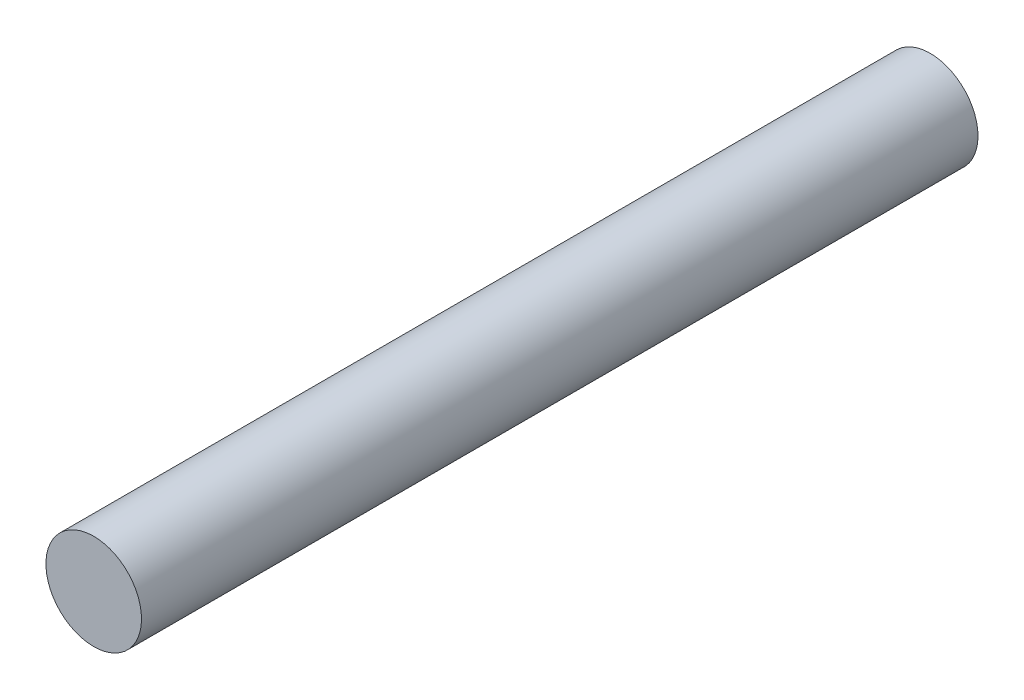
ISO-10303-21;
HEADER;
FILE_DESCRIPTION(('STEP AP214'),'2;1');
FILE_NAME('part.step','',(''),(''),'','','');
FILE_SCHEMA(('AUTOMOTIVE_DESIGN { 1 0 10303 214 1 1 1 1 }'));
ENDSEC;
DATA;
#1=APPLICATION_CONTEXT('core data for automotive mechanical design processes');
#2=APPLICATION_PROTOCOL_DEFINITION('international standard','automotive_design',2000,#1);
#3=PRODUCT_CONTEXT('',#1,'mechanical');
#4=PRODUCT('Part','Part','',(#3));
#5=PRODUCT_RELATED_PRODUCT_CATEGORY('part','',(#4));
#6=PRODUCT_DEFINITION_FORMATION('','',#4);
#7=PRODUCT_DEFINITION_CONTEXT('part definition',#1,'design');
#8=PRODUCT_DEFINITION('design','',#6,#7);
#9=PRODUCT_DEFINITION_SHAPE('','',#8);
#10=(LENGTH_UNIT() NAMED_UNIT(*) SI_UNIT(.MILLI.,.METRE.));
#11=(NAMED_UNIT(*) PLANE_ANGLE_UNIT() SI_UNIT($,.RADIAN.));
#12=(NAMED_UNIT(*) SI_UNIT($,.STERADIAN.) SOLID_ANGLE_UNIT());
#13=UNCERTAINTY_MEASURE_WITH_UNIT(LENGTH_MEASURE(1.E-05),#10,'distance_accuracy_value','');
#14=(GEOMETRIC_REPRESENTATION_CONTEXT(3) GLOBAL_UNCERTAINTY_ASSIGNED_CONTEXT((#13)) GLOBAL_UNIT_ASSIGNED_CONTEXT((#10,
#11,#12)) REPRESENTATION_CONTEXT('',''));
#15=CARTESIAN_POINT('',(0.,0.,0.));
#16=DIRECTION('',(0.,0.,1.));
#17=DIRECTION('',(1.,0.,0.));
#18=AXIS2_PLACEMENT_3D('',#15,#16,#17);
#19=CARTESIAN_POINT('',(67.2550134984817,46.7975623829489,70.));
#20=DIRECTION('',(0.,0.,-1.));
#21=DIRECTION('',(-1.,0.,0.));
#22=AXIS2_PLACEMENT_3D('',#19,#20,#21);
#23=CYLINDRICAL_SURFACE('',#22,4.00000000000001);
#24=CARTESIAN_POINT('',(67.2550134984817,46.7975623829489,70.));
#25=DIRECTION('',(0.,0.,1.));
#26=DIRECTION('',(1.,0.,0.));
#27=AXIS2_PLACEMENT_3D('',#24,#25,#26);
#28=CIRCLE('',#27,4.00000000000001);
#29=CARTESIAN_POINT('',(71.2550134984817,46.7975623829489,70.));
#30=VERTEX_POINT('',#29);
#31=EDGE_CURVE('E10',#30,#30,#28,.T.);
#32=ORIENTED_EDGE('',*,*,#31,.F.);
#33=EDGE_LOOP('',(#32));
#34=FACE_BOUND('',#33,.T.);
#35=CARTESIAN_POINT('',(67.2550134984817,46.7975623829489,0.));
#36=DIRECTION('',(0.,0.,1.));
#37=DIRECTION('',(1.,0.,0.));
#38=AXIS2_PLACEMENT_3D('',#35,#36,#37);
#39=CIRCLE('',#38,4.00000000000001);
#40=CARTESIAN_POINT('',(71.2550134984817,46.7975623829489,0.));
#41=VERTEX_POINT('',#40);
#42=EDGE_CURVE('E44',#41,#41,#39,.T.);
#43=ORIENTED_EDGE('',*,*,#42,.T.);
#44=EDGE_LOOP('',(#43));
#45=FACE_BOUND('',#44,.T.);
#46=ADVANCED_FACE('F41',(#34,#45),#23,.T.);
#47=CARTESIAN_POINT('',(67.2550134984817,46.7975623829489,70.));
#48=DIRECTION('',(0.,0.,1.));
#49=DIRECTION('',(1.,0.,0.));
#50=AXIS2_PLACEMENT_3D('',#47,#48,#49);
#51=PLANE('',#50);
#52=ORIENTED_EDGE('',*,*,#31,.T.);
#53=EDGE_LOOP('',(#52));
#54=FACE_BOUND('',#53,.T.);
#55=ADVANCED_FACE('F58',(#54),#51,.T.);
#56=CARTESIAN_POINT('',(67.2550134984817,46.7975623829489,0.));
#57=DIRECTION('',(0.,0.,1.));
#58=DIRECTION('',(1.,0.,0.));
#59=AXIS2_PLACEMENT_3D('',#56,#57,#58);
#60=PLANE('',#59);
#61=ORIENTED_EDGE('',*,*,#42,.F.);
#62=EDGE_LOOP('',(#61));
#63=FACE_BOUND('',#62,.T.);
#64=ADVANCED_FACE('F56',(#63),#60,.F.);
#65=CLOSED_SHELL('',(#46,#55,#64));
#66=MANIFOLD_SOLID_BREP('B2',#65);
#67=ADVANCED_BREP_SHAPE_REPRESENTATION('',(#18,#66),#14);
#68=SHAPE_DEFINITION_REPRESENTATION(#9,#67);
ENDSEC;
END-ISO-10303-21;
